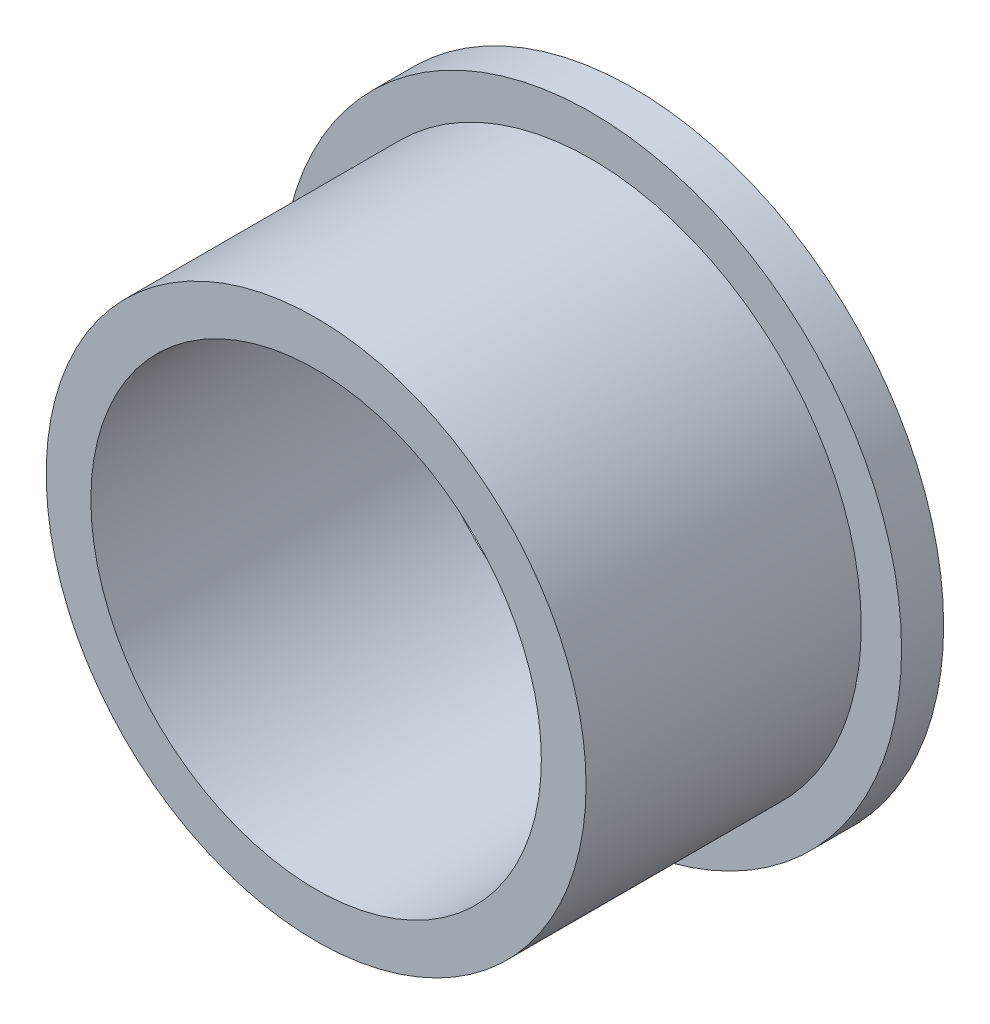
ISO-10303-21;
HEADER;
FILE_DESCRIPTION(('STEP AP214'),'2;1');
FILE_NAME('part.step','',(''),(''),'','','');
FILE_SCHEMA(('AUTOMOTIVE_DESIGN { 1 0 10303 214 1 1 1 1 }'));
ENDSEC;
DATA;
#1=APPLICATION_CONTEXT('core data for automotive mechanical design processes');
#2=APPLICATION_PROTOCOL_DEFINITION('international standard','automotive_design',2000,#1);
#3=PRODUCT_CONTEXT('',#1,'mechanical');
#4=PRODUCT('Part','Part','',(#3));
#5=PRODUCT_RELATED_PRODUCT_CATEGORY('part','',(#4));
#6=PRODUCT_DEFINITION_FORMATION('','',#4);
#7=PRODUCT_DEFINITION_CONTEXT('part definition',#1,'design');
#8=PRODUCT_DEFINITION('design','',#6,#7);
#9=PRODUCT_DEFINITION_SHAPE('','',#8);
#10=(LENGTH_UNIT() NAMED_UNIT(*) SI_UNIT(.MILLI.,.METRE.));
#11=(NAMED_UNIT(*) PLANE_ANGLE_UNIT() SI_UNIT($,.RADIAN.));
#12=(NAMED_UNIT(*) SI_UNIT($,.STERADIAN.) SOLID_ANGLE_UNIT());
#13=UNCERTAINTY_MEASURE_WITH_UNIT(LENGTH_MEASURE(1.E-05),#10,'distance_accuracy_value','');
#14=(GEOMETRIC_REPRESENTATION_CONTEXT(3) GLOBAL_UNCERTAINTY_ASSIGNED_CONTEXT((#13)) GLOBAL_UNIT_ASSIGNED_CONTEXT((#10,
#11,#12)) REPRESENTATION_CONTEXT('',''));
#15=CARTESIAN_POINT('',(0.,0.,0.));
#16=DIRECTION('',(0.,0.,1.));
#17=DIRECTION('',(1.,0.,0.));
#18=AXIS2_PLACEMENT_3D('',#15,#16,#17);
#19=CARTESIAN_POINT('',(0.,0.,2.4));
#20=DIRECTION('',(0.,0.,-1.));
#21=DIRECTION('',(-1.,0.,0.));
#22=AXIS2_PLACEMENT_3D('',#19,#20,#21);
#23=CYLINDRICAL_SURFACE('',#22,17.7);
#24=CARTESIAN_POINT('',(0.,0.,2.4));
#25=DIRECTION('',(0.,0.,1.));
#26=DIRECTION('',(1.,0.,0.));
#27=AXIS2_PLACEMENT_3D('',#24,#25,#26);
#28=CIRCLE('',#27,17.7);
#29=CARTESIAN_POINT('',(17.7,0.,2.4));
#30=VERTEX_POINT('',#29);
#31=EDGE_CURVE('E49',#30,#30,#28,.T.);
#32=ORIENTED_EDGE('',*,*,#31,.F.);
#33=EDGE_LOOP('',(#32));
#34=FACE_BOUND('',#33,.T.);
#35=CARTESIAN_POINT('',(0.,0.,0.));
#36=DIRECTION('',(0.,0.,1.));
#37=DIRECTION('',(1.,0.,0.));
#38=AXIS2_PLACEMENT_3D('',#35,#36,#37);
#39=CIRCLE('',#38,17.7);
#40=CARTESIAN_POINT('',(17.7,0.,0.));
#41=VERTEX_POINT('',#40);
#42=EDGE_CURVE('E44',#41,#41,#39,.T.);
#43=ORIENTED_EDGE('',*,*,#42,.T.);
#44=EDGE_LOOP('',(#43));
#45=FACE_BOUND('',#44,.T.);
#46=ADVANCED_FACE('F41',(#34,#45),#23,.T.);
#47=CARTESIAN_POINT('',(0.,0.,2.4));
#48=DIRECTION('',(0.,0.,1.));
#49=DIRECTION('',(1.,0.,0.));
#50=AXIS2_PLACEMENT_3D('',#47,#48,#49);
#51=PLANE('',#50);
#52=CARTESIAN_POINT('',(0.,0.,2.4));
#53=DIRECTION('',(0.,0.,1.));
#54=DIRECTION('',(1.,0.,0.));
#55=AXIS2_PLACEMENT_3D('',#52,#53,#54);
#56=CIRCLE('',#55,15.4);
#57=CARTESIAN_POINT('',(15.4,0.,2.4));
#58=VERTEX_POINT('',#57);
#59=EDGE_CURVE('E10',#58,#58,#56,.T.);
#60=ORIENTED_EDGE('',*,*,#59,.F.);
#61=EDGE_LOOP('',(#60));
#62=FACE_BOUND('',#61,.T.);
#63=ORIENTED_EDGE('',*,*,#31,.T.);
#64=EDGE_LOOP('',(#63));
#65=FACE_BOUND('',#64,.T.);
#66=ADVANCED_FACE('F85',(#62,#65),#51,.T.);
#67=CARTESIAN_POINT('',(0.,0.,0.));
#68=DIRECTION('',(0.,0.,1.));
#69=DIRECTION('',(1.,0.,0.));
#70=AXIS2_PLACEMENT_3D('',#67,#68,#69);
#71=PLANE('',#70);
#72=CARTESIAN_POINT('',(0.,0.,0.));
#73=DIRECTION('',(0.,0.,1.));
#74=DIRECTION('',(1.,0.,0.));
#75=AXIS2_PLACEMENT_3D('',#72,#73,#74);
#76=CIRCLE('',#75,12.85);
#77=CARTESIAN_POINT('',(12.85,0.,0.));
#78=VERTEX_POINT('',#77);
#79=EDGE_CURVE('E60',#78,#78,#76,.T.);
#80=ORIENTED_EDGE('',*,*,#79,.T.);
#81=EDGE_LOOP('',(#80));
#82=FACE_BOUND('',#81,.T.);
#83=ORIENTED_EDGE('',*,*,#42,.F.);
#84=EDGE_LOOP('',(#83));
#85=FACE_BOUND('',#84,.T.);
#86=ADVANCED_FACE('F80',(#82,#85),#71,.F.);
#87=CARTESIAN_POINT('',(0.,0.,18.1));
#88=DIRECTION('',(0.,0.,-1.));
#89=DIRECTION('',(-1.,0.,0.));
#90=AXIS2_PLACEMENT_3D('',#87,#88,#89);
#91=CYLINDRICAL_SURFACE('',#90,15.4);
#92=CARTESIAN_POINT('',(0.,0.,18.1));
#93=DIRECTION('',(0.,0.,1.));
#94=DIRECTION('',(1.,0.,0.));
#95=AXIS2_PLACEMENT_3D('',#92,#93,#94);
#96=CIRCLE('',#95,15.4);
#97=CARTESIAN_POINT('',(15.4,0.,18.1));
#98=VERTEX_POINT('',#97);
#99=EDGE_CURVE('E56',#98,#98,#96,.T.);
#100=ORIENTED_EDGE('',*,*,#99,.F.);
#101=EDGE_LOOP('',(#100));
#102=FACE_BOUND('',#101,.T.);
#103=ORIENTED_EDGE('',*,*,#59,.T.);
#104=EDGE_LOOP('',(#103));
#105=FACE_BOUND('',#104,.T.);
#106=ADVANCED_FACE('F75',(#102,#105),#91,.T.);
#107=CARTESIAN_POINT('',(0.,0.,18.1));
#108=DIRECTION('',(0.,0.,1.));
#109=DIRECTION('',(1.,0.,0.));
#110=AXIS2_PLACEMENT_3D('',#107,#108,#109);
#111=PLANE('',#110);
#112=CARTESIAN_POINT('',(0.,0.,18.1));
#113=DIRECTION('',(0.,0.,1.));
#114=DIRECTION('',(1.,0.,0.));
#115=AXIS2_PLACEMENT_3D('',#112,#113,#114);
#116=CIRCLE('',#115,12.85);
#117=CARTESIAN_POINT('',(12.85,0.,18.1));
#118=VERTEX_POINT('',#117);
#119=EDGE_CURVE('E64',#118,#118,#116,.T.);
#120=ORIENTED_EDGE('',*,*,#119,.F.);
#121=EDGE_LOOP('',(#120));
#122=FACE_BOUND('',#121,.T.);
#123=ORIENTED_EDGE('',*,*,#99,.T.);
#124=EDGE_LOOP('',(#123));
#125=FACE_BOUND('',#124,.T.);
#126=ADVANCED_FACE('F72',(#122,#125),#111,.T.);
#127=CARTESIAN_POINT('',(0.,0.,-1.9));
#128=DIRECTION('',(0.,0.,1.));
#129=DIRECTION('',(1.,0.,0.));
#130=AXIS2_PLACEMENT_3D('',#127,#128,#129);
#131=CYLINDRICAL_SURFACE('',#130,12.85);
#132=ORIENTED_EDGE('',*,*,#119,.T.);
#133=EDGE_LOOP('',(#132));
#134=FACE_BOUND('',#133,.T.);
#135=ORIENTED_EDGE('',*,*,#79,.F.);
#136=EDGE_LOOP('',(#135));
#137=FACE_BOUND('',#136,.T.);
#138=ADVANCED_FACE('F69',(#134,#137),#131,.F.);
#139=CLOSED_SHELL('',(#46,#66,#86,#106,#126,#138));
#140=MANIFOLD_SOLID_BREP('B2',#139);
#141=ADVANCED_BREP_SHAPE_REPRESENTATION('',(#18,#140),#14);
#142=SHAPE_DEFINITION_REPRESENTATION(#9,#141);
ENDSEC;
END-ISO-10303-21;
